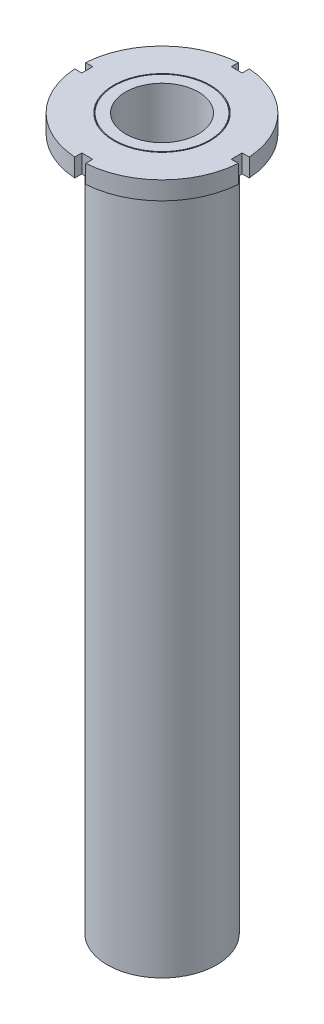
ISO-10303-21;
HEADER;
FILE_DESCRIPTION(('STEP AP214'),'2;1');
FILE_NAME('part.step','',(''),(''),'','','');
FILE_SCHEMA(('AUTOMOTIVE_DESIGN { 1 0 10303 214 1 1 1 1 }'));
ENDSEC;
DATA;
#1=APPLICATION_CONTEXT('core data for automotive mechanical design processes');
#2=APPLICATION_PROTOCOL_DEFINITION('international standard','automotive_design',2000,#1);
#3=PRODUCT_CONTEXT('',#1,'mechanical');
#4=PRODUCT('Part','Part','',(#3));
#5=PRODUCT_RELATED_PRODUCT_CATEGORY('part','',(#4));
#6=PRODUCT_DEFINITION_FORMATION('','',#4);
#7=PRODUCT_DEFINITION_CONTEXT('part definition',#1,'design');
#8=PRODUCT_DEFINITION('design','',#6,#7);
#9=PRODUCT_DEFINITION_SHAPE('','',#8);
#10=(LENGTH_UNIT() NAMED_UNIT(*) SI_UNIT(.MILLI.,.METRE.));
#11=(NAMED_UNIT(*) PLANE_ANGLE_UNIT() SI_UNIT($,.RADIAN.));
#12=(NAMED_UNIT(*) SI_UNIT($,.STERADIAN.) SOLID_ANGLE_UNIT());
#13=UNCERTAINTY_MEASURE_WITH_UNIT(LENGTH_MEASURE(1.E-05),#10,'distance_accuracy_value','');
#14=(GEOMETRIC_REPRESENTATION_CONTEXT(3) GLOBAL_UNCERTAINTY_ASSIGNED_CONTEXT((#13)) GLOBAL_UNIT_ASSIGNED_CONTEXT((#10,
#11,#12)) REPRESENTATION_CONTEXT('',''));
#15=CARTESIAN_POINT('',(0.,0.,0.));
#16=DIRECTION('',(0.,0.,1.));
#17=DIRECTION('',(1.,0.,0.));
#18=AXIS2_PLACEMENT_3D('',#15,#16,#17);
#19=CARTESIAN_POINT('',(0.,0.,0.));
#20=DIRECTION('',(0.,1.,0.));
#21=DIRECTION('',(0.,0.,1.));
#22=AXIS2_PLACEMENT_3D('',#19,#20,#21);
#23=CYLINDRICAL_SURFACE('',#22,10.);
#24=CARTESIAN_POINT('',(0.,0.,0.));
#25=DIRECTION('',(0.,1.,0.));
#26=DIRECTION('',(0.,0.,1.));
#27=AXIS2_PLACEMENT_3D('',#24,#25,#26);
#28=CIRCLE('',#27,10.);
#29=CARTESIAN_POINT('',(0.,0.,10.));
#30=VERTEX_POINT('',#29);
#31=EDGE_CURVE('E292',#30,#30,#28,.T.);
#32=ORIENTED_EDGE('',*,*,#31,.F.);
#33=EDGE_LOOP('',(#32));
#34=FACE_BOUND('',#33,.T.);
#35=CARTESIAN_POINT('',(0.,195.,0.));
#36=DIRECTION('',(0.,1.,0.));
#37=DIRECTION('',(0.,0.,1.));
#38=AXIS2_PLACEMENT_3D('',#35,#36,#37);
#39=CIRCLE('',#38,10.);
#40=CARTESIAN_POINT('',(0.,195.,10.));
#41=VERTEX_POINT('',#40);
#42=EDGE_CURVE('E296',#41,#41,#39,.T.);
#43=ORIENTED_EDGE('',*,*,#42,.T.);
#44=EDGE_LOOP('',(#43));
#45=FACE_BOUND('',#44,.T.);
#46=CARTESIAN_POINT('',(-9.88685996664259,180.,1.5));
#47=CARTESIAN_POINT('',(-9.88686136668593,179.91625443071,1.49999654107284));
#48=CARTESIAN_POINT('',(-9.88793551739101,179.832460249249,1.49296296388491));
#49=CARTESIAN_POINT('',(-9.8921131480324,179.667214685117,1.46502196657001));
#50=CARTESIAN_POINT('',(-9.8952186073143,179.58576566852,1.44410101402628));
#51=CARTESIAN_POINT('',(-9.90309938986228,179.427626244553,1.38902526098083));
#52=CARTESIAN_POINT('',(-9.90787343131536,179.350932237458,1.35488061681396));
#53=CARTESIAN_POINT('',(-9.91855194113145,179.204372969228,1.2743506308779));
#54=CARTESIAN_POINT('',(-9.92445625383668,179.134506769786,1.22796697429871));
#55=CARTESIAN_POINT('',(-9.9367828924804,179.003016183246,1.12387902418558));
#56=CARTESIAN_POINT('',(-9.94320862458058,178.941454386593,1.06609605584821));
#57=CARTESIAN_POINT('',(-9.95582368169047,178.828862514344,0.941019605444387));
#58=CARTESIAN_POINT('',(-9.96201299368614,178.777833017833,0.873725600786538));
#59=CARTESIAN_POINT('',(-9.97349347428185,178.687523368309,0.731136358052754));
#60=CARTESIAN_POINT('',(-9.97878018435569,178.648300849678,0.655804227365782));
#61=CARTESIAN_POINT('',(-9.98782206746405,178.583088401192,0.499528850106982));
#62=CARTESIAN_POINT('',(-9.99157732141945,178.557097772157,0.418585900270671));
#63=CARTESIAN_POINT('',(-9.99710914797782,178.519276611469,0.254031123090553));
#64=CARTESIAN_POINT('',(-9.99890035887344,178.507341273613,0.170443884389853));
#65=CARTESIAN_POINT('',(-10.0003524476958,178.497644065175,0.00243520401946687));
#66=CARTESIAN_POINT('',(-10.0000134440494,178.49988140668,-0.0819861910157597));
#67=CARTESIAN_POINT('',(-9.99725499660796,178.518383337762,-0.248551718200534));
#68=CARTESIAN_POINT('',(-9.99485227652479,178.534535171791,-0.330708691400022));
#69=CARTESIAN_POINT('',(-9.98825500227851,178.580230606323,-0.491132829143152));
#70=CARTESIAN_POINT('',(-9.98406040199739,178.609774551501,-0.569399893513498));
#71=CARTESIAN_POINT('',(-9.97432193873206,178.681530996917,-0.720163780770331));
#72=CARTESIAN_POINT('',(-9.96877303515638,178.723790965109,-0.792637672323608));
#73=CARTESIAN_POINT('',(-9.95694438245421,178.81974519367,-0.929507907150187));
#74=CARTESIAN_POINT('',(-9.95066458523184,178.873440206707,-0.993903718271746));
#75=CARTESIAN_POINT('',(-9.93800158192626,178.991368448827,-1.11345448272266));
#76=CARTESIAN_POINT('',(-9.93161796623256,179.05570012197,-1.16851232950947));
#77=CARTESIAN_POINT('',(-9.91952704453523,179.192741077124,-1.26706599338813));
#78=CARTESIAN_POINT('',(-9.91381974269649,179.26545041072,-1.31056173928));
#79=CARTESIAN_POINT('',(-9.90372775286855,179.417283962941,-1.38476964534605));
#80=CARTESIAN_POINT('',(-9.89934409845291,179.496413133662,-1.41547182270082));
#81=CARTESIAN_POINT('',(-9.89241402899059,179.658785255147,-1.46312336208879));
#82=CARTESIAN_POINT('',(-9.88986748446299,179.742027915547,-1.48007369337326));
#83=CARTESIAN_POINT('',(-9.88692451395027,179.909400089577,-1.49960720086656));
#84=CARTESIAN_POINT('',(-9.88650748802574,179.993513188202,-1.50232803265052));
#85=CARTESIAN_POINT('',(-9.88781607937153,180.160994194817,-1.49369057019819));
#86=CARTESIAN_POINT('',(-9.88954163015778,180.244362125851,-1.48233271282302));
#87=CARTESIAN_POINT('',(-9.89492202461453,180.407559817966,-1.44597702952766));
#88=CARTESIAN_POINT('',(-9.89856716482858,180.487405204942,-1.42104778527821));
#89=CARTESIAN_POINT('',(-9.90736801825768,180.641784092049,-1.35832831947087));
#90=CARTESIAN_POINT('',(-9.91252380607176,180.716317329628,-1.32053746276389));
#91=CARTESIAN_POINT('',(-9.92381355687063,180.858573260335,-1.23283677995324));
#92=CARTESIAN_POINT('',(-9.92995459279988,180.92624044728,-1.18283784561766));
#93=CARTESIAN_POINT('',(-9.94250159433355,181.052272859874,-1.07226416837202));
#94=CARTESIAN_POINT('',(-9.94890757490292,181.110637559181,-1.0116888274468));
#95=CARTESIAN_POINT('',(-9.96132705217386,181.216902606634,-0.881075619628179));
#96=CARTESIAN_POINT('',(-9.96733683460423,181.264711728242,-0.810963126771943));
#97=CARTESIAN_POINT('',(-9.97822905032016,181.347872905263,-0.663622080263657));
#98=CARTESIAN_POINT('',(-9.98311151444563,181.383225301465,-0.586393721360416));
#99=CARTESIAN_POINT('',(-9.99118269660795,181.440323742488,-0.427297995861125));
#100=CARTESIAN_POINT('',(-9.99437761717899,181.462119667078,-0.34544885875428));
#101=CARTESIAN_POINT('',(-9.99873976656896,181.491647879537,-0.179200815501173));
#102=CARTESIAN_POINT('',(-9.99990712930801,181.499381096249,-0.0948020781305642));
#103=CARTESIAN_POINT('',(-10.0000812905914,181.500541704549,0.0732645908608318));
#104=CARTESIAN_POINT('',(-9.99910917023796,181.494108680877,0.156931570212065));
#105=CARTESIAN_POINT('',(-9.99515610519141,181.467418611579,0.321979795323121));
#106=CARTESIAN_POINT('',(-9.99217516692666,181.447161610191,0.403361048396528));
#107=CARTESIAN_POINT('',(-9.98453786742463,181.39344812443,0.561489374379677));
#108=CARTESIAN_POINT('',(-9.97988273316946,181.360001304861,0.638239793148799));
#109=CARTESIAN_POINT('',(-9.96940834495499,181.280872512017,0.785061117896618));
#110=CARTESIAN_POINT('',(-9.96358905320338,181.23519014152,0.855131806920724));
#111=CARTESIAN_POINT('',(-9.95136510636178,181.132382301171,0.987312585191968));
#112=CARTESIAN_POINT('',(-9.94495548425942,181.075153774184,1.04934206644639));
#113=CARTESIAN_POINT('',(-9.93231001689001,180.95109492692,1.16296808390268));
#114=CARTESIAN_POINT('',(-9.92607421276291,180.884262356176,1.21456216798985));
#115=CARTESIAN_POINT('',(-9.91444484029116,180.742451016767,1.30611310822975));
#116=CARTESIAN_POINT('',(-9.90905620156986,180.667428582978,1.34600294291209));
#117=CARTESIAN_POINT('',(-9.89978909110724,180.511703223237,1.41255613872045));
#118=CARTESIAN_POINT('',(-9.89590905307931,180.431006292142,1.43923322574898));
#119=CARTESIAN_POINT('',(-9.89099485524825,180.291622563744,1.47254951890027));
#120=CARTESIAN_POINT('',(-9.88945249382379,180.233796603076,1.4828276978042));
#121=CARTESIAN_POINT('',(-9.88738456567011,180.117321708266,1.49655410576574));
#122=CARTESIAN_POINT('',(-9.88685898576155,180.0586727848,1.50000242335076));
#123=CARTESIAN_POINT('',(-9.88685996664259,180.,1.5));
#124=B_SPLINE_CURVE_WITH_KNOTS('',3,(#46,#47,#48,#49,#50,#51,#52,#53,#54,#55,#56,#57,#58,#59,
#60,#61,#62,#63,#64,#65,#66,#67,#68,#69,#70,#71,#72,#73,#74,#75,#76,#77,#78,#79,#80,#81,#82,#83,
#84,#85,#86,#87,#88,#89,#90,#91,#92,#93,#94,#95,#96,#97,#98,#99,#100,#101,#102,#103,#104,#105,
#106,#107,#108,#109,#110,#111,#112,#113,#114,#115,#116,#117,#118,#119,#120,#121,#122,#123),
.UNSPECIFIED.,.T.,.F.,(4,2,2,2,2,2,2,2,2,2,2,2,2,2,2,2,2,2,2,2,2,2,2,2,2,2,2,2,2,2,2,2,2,2,2,2,
2,2,4),(0.,0.251022251804883,0.502289469561815,0.753364085335707,1.00440414866133,
1.25724158649107,1.51009292207815,1.76415922105781,2.01821209364502,2.27035832534398,
2.52249053939376,2.7725986251573,3.02271314839403,3.27377316386455,3.52484970949275,
3.77839544666272,4.03194274514351,4.28568751773139,4.53941440444342,4.79068214603744,
5.0419420909992,5.29194394807375,5.54195815286117,5.79385486001301,6.04576581461802,
6.29977537753518,6.55377799071857,6.80684040891092,7.05988611170474,7.31044963622328,
7.56101235892824,7.81139182257835,8.06177941567107,8.31450950010968,8.56729890236864,
8.82150878824931,9.07545403445563,9.25132441891613,9.42719252376192),.UNSPECIFIED.);
#125=CARTESIAN_POINT('',(-9.88685996664259,180.,1.5));
#126=VERTEX_POINT('',#125);
#127=EDGE_CURVE('E51',#126,#126,#124,.T.);
#128=ORIENTED_EDGE('',*,*,#127,.F.);
#129=EDGE_LOOP('',(#128));
#130=FACE_BOUND('',#129,.T.);
#131=CARTESIAN_POINT('',(9.88685996664259,180.,1.5));
#132=CARTESIAN_POINT('',(9.88686136668593,180.08374556929,1.49999654107284));
#133=CARTESIAN_POINT('',(9.88793551739101,180.167539750751,1.49296296388491));
#134=CARTESIAN_POINT('',(9.8921131480324,180.332785314883,1.46502196657001));
#135=CARTESIAN_POINT('',(9.8952186073143,180.41423433148,1.44410101402628));
#136=CARTESIAN_POINT('',(9.90309938986228,180.572373755447,1.38902526098083));
#137=CARTESIAN_POINT('',(9.90787343131536,180.649067762542,1.35488061681396));
#138=CARTESIAN_POINT('',(9.91855194113145,180.795627030772,1.2743506308779));
#139=CARTESIAN_POINT('',(9.92445625383668,180.865493230214,1.22796697429871));
#140=CARTESIAN_POINT('',(9.9367828924804,180.996983816754,1.12387902418558));
#141=CARTESIAN_POINT('',(9.94320862458058,181.058545613407,1.0660960558482));
#142=CARTESIAN_POINT('',(9.95582368169047,181.171137485655,0.941019605444375));
#143=CARTESIAN_POINT('',(9.96201299368615,181.222166982167,0.873725600786533));
#144=CARTESIAN_POINT('',(9.97349347428185,181.312476631691,0.731136358052753));
#145=CARTESIAN_POINT('',(9.97878018435569,181.351699150322,0.655804227365775));
#146=CARTESIAN_POINT('',(9.98782206746405,181.416911598808,0.499528850106974));
#147=CARTESIAN_POINT('',(9.99157732141945,181.442902227843,0.418585900270668));
#148=CARTESIAN_POINT('',(9.99710914797782,181.480723388531,0.254031123090553));
#149=CARTESIAN_POINT('',(9.99890035887344,181.492658726387,0.170443884389853));
#150=CARTESIAN_POINT('',(10.0003524476958,181.502355934825,0.00243520401946675));
#151=CARTESIAN_POINT('',(10.0000134440494,181.50011859332,-0.0819861910157597));
#152=CARTESIAN_POINT('',(9.99725499660796,181.481616662238,-0.248551718200534));
#153=CARTESIAN_POINT('',(9.99485227652479,181.465464828209,-0.330708691400022));
#154=CARTESIAN_POINT('',(9.98825500227851,181.419769393677,-0.491132829143152));
#155=CARTESIAN_POINT('',(9.98406040199739,181.390225448499,-0.569399893513498));
#156=CARTESIAN_POINT('',(9.97432193873206,181.318469003083,-0.720163780770331));
#157=CARTESIAN_POINT('',(9.96877303515638,181.276209034891,-0.792637672323608));
#158=CARTESIAN_POINT('',(9.95694438245421,181.18025480633,-0.929507907150187));
#159=CARTESIAN_POINT('',(9.95066458523184,181.126559793293,-0.993903718271746));
#160=CARTESIAN_POINT('',(9.93800158192626,181.008631551173,-1.11345448272266));
#161=CARTESIAN_POINT('',(9.93161796623256,180.94429987803,-1.16851232950947));
#162=CARTESIAN_POINT('',(9.91952704453523,180.807258922876,-1.26706599338813));
#163=CARTESIAN_POINT('',(9.91381974269649,180.73454958928,-1.31056173928));
#164=CARTESIAN_POINT('',(9.90372775286855,180.582716037059,-1.38476964534605));
#165=CARTESIAN_POINT('',(9.89934409845291,180.503586866338,-1.41547182270082));
#166=CARTESIAN_POINT('',(9.89241402899059,180.341214744853,-1.46312336208879));
#167=CARTESIAN_POINT('',(9.88986748446299,180.257972084453,-1.48007369337326));
#168=CARTESIAN_POINT('',(9.88692451395027,180.090599910422,-1.49960720086656));
#169=CARTESIAN_POINT('',(9.88650748802574,180.006486811798,-1.50232803265052));
#170=CARTESIAN_POINT('',(9.88781607937153,179.839005805183,-1.49369057019819));
#171=CARTESIAN_POINT('',(9.88954163015778,179.755637874149,-1.48233271282302));
#172=CARTESIAN_POINT('',(9.89492202461453,179.592440182034,-1.44597702952766));
#173=CARTESIAN_POINT('',(9.89856716482858,179.512594795058,-1.4210477852782));
#174=CARTESIAN_POINT('',(9.90736801825768,179.358215907951,-1.35832831947086));
#175=CARTESIAN_POINT('',(9.91252380607176,179.283682670372,-1.32053746276389));
#176=CARTESIAN_POINT('',(9.92381355687063,179.141426739665,-1.23283677995324));
#177=CARTESIAN_POINT('',(9.92995459279988,179.07375955272,-1.18283784561766));
#178=CARTESIAN_POINT('',(9.94250159433355,178.947727140126,-1.07226416837202));
#179=CARTESIAN_POINT('',(9.94890757490292,178.889362440819,-1.0116888274468));
#180=CARTESIAN_POINT('',(9.96132705217386,178.783097393366,-0.881075619628186));
#181=CARTESIAN_POINT('',(9.96733683460423,178.735288271758,-0.81096312677196));
#182=CARTESIAN_POINT('',(9.97822905032015,178.652127094737,-0.663622080263675));
#183=CARTESIAN_POINT('',(9.98311151444563,178.616774698535,-0.586393721360424));
#184=CARTESIAN_POINT('',(9.99118269660795,178.559676257512,-0.427297995861123));
#185=CARTESIAN_POINT('',(9.99437761717899,178.537880332922,-0.345448858754279));
#186=CARTESIAN_POINT('',(9.99873976656896,178.508352120463,-0.179200815501174));
#187=CARTESIAN_POINT('',(9.99990712930801,178.500618903751,-0.0948020781305643));
#188=CARTESIAN_POINT('',(10.0000812905914,178.499458295451,0.0732645908608319));
#189=CARTESIAN_POINT('',(9.99910917023796,178.505891319123,0.156931570212065));
#190=CARTESIAN_POINT('',(9.99515610519141,178.532581388421,0.321979795323121));
#191=CARTESIAN_POINT('',(9.99217516692666,178.552838389809,0.403361048396527));
#192=CARTESIAN_POINT('',(9.98453786742463,178.60655187557,0.561489374379677));
#193=CARTESIAN_POINT('',(9.97988273316946,178.639998695139,0.638239793148799));
#194=CARTESIAN_POINT('',(9.96940834495499,178.719127487983,0.785061117896618));
#195=CARTESIAN_POINT('',(9.96358905320338,178.76480985848,0.855131806920724));
#196=CARTESIAN_POINT('',(9.95136510636178,178.867617698829,0.987312585191968));
#197=CARTESIAN_POINT('',(9.94495548425942,178.924846225816,1.04934206644639));
#198=CARTESIAN_POINT('',(9.93231001689001,179.04890507308,1.16296808390268));
#199=CARTESIAN_POINT('',(9.92607421276291,179.115737643824,1.21456216798984));
#200=CARTESIAN_POINT('',(9.91444484029116,179.257548983233,1.30611310822976));
#201=CARTESIAN_POINT('',(9.90905620156985,179.332571417022,1.34600294291211));
#202=CARTESIAN_POINT('',(9.89978909110724,179.488296776763,1.41255613872046));
#203=CARTESIAN_POINT('',(9.89590905307931,179.568993707858,1.43923322574898));
#204=CARTESIAN_POINT('',(9.89099485524825,179.708377436256,1.47254951890026));
#205=CARTESIAN_POINT('',(9.88945249382379,179.766203396924,1.4828276978042));
#206=CARTESIAN_POINT('',(9.88738456567011,179.882678291734,1.49655410576574));
#207=CARTESIAN_POINT('',(9.88685898576155,179.9413272152,1.50000242335076));
#208=CARTESIAN_POINT('',(9.88685996664259,180.,1.5));
#209=B_SPLINE_CURVE_WITH_KNOTS('',3,(#131,#132,#133,#134,#135,#136,#137,#138,#139,#140,#141,
#142,#143,#144,#145,#146,#147,#148,#149,#150,#151,#152,#153,#154,#155,#156,#157,#158,#159,#160,
#161,#162,#163,#164,#165,#166,#167,#168,#169,#170,#171,#172,#173,#174,#175,#176,#177,#178,#179,
#180,#181,#182,#183,#184,#185,#186,#187,#188,#189,#190,#191,#192,#193,#194,#195,#196,#197,#198,
#199,#200,#201,#202,#203,#204,#205,#206,#207,#208),.UNSPECIFIED.,.T.,.F.,(4,2,2,2,2,2,2,2,2,2,2,
2,2,2,2,2,2,2,2,2,2,2,2,2,2,2,2,2,2,2,2,2,2,2,2,2,2,2,4),(0.,0.251022251804883,
0.502289469561815,0.753364085335707,1.00440414866133,1.25724158649108,1.51009292207815,
1.76415922105782,2.01821209364502,2.27035832534398,2.52249053939375,2.77259862515729,
3.02271314839403,3.27377316386455,3.52484970949275,3.77839544666271,4.03194274514351,
4.28568751773139,4.53941440444341,4.79068214603744,5.0419420909992,5.29194394807378,
5.54195815286117,5.79385486001301,6.04576581461802,6.29977537753516,6.55377799071857,
6.80684040891092,7.05988611170474,7.31044963622328,7.56101235892824,7.81139182257835,
8.06177941567107,8.31450950010968,8.56729890236864,8.82150878824934,9.07545403445563,
9.25132441891613,9.42719252376192),.UNSPECIFIED.);
#210=CARTESIAN_POINT('',(9.88685996664259,180.,1.5));
#211=VERTEX_POINT('',#210);
#212=EDGE_CURVE('E11',#211,#211,#209,.T.);
#213=ORIENTED_EDGE('',*,*,#212,.F.);
#214=EDGE_LOOP('',(#213));
#215=FACE_BOUND('',#214,.T.);
#216=ADVANCED_FACE('F37',(#34,#45,#130,#215),#23,.F.);
#217=CARTESIAN_POINT('',(0.,190.,0.));
#218=DIRECTION('',(0.,-1.,0.));
#219=DIRECTION('',(0.,0.,-1.));
#220=AXIS2_PLACEMENT_3D('',#217,#218,#219);
#221=CYLINDRICAL_SURFACE('',#220,15.);
#222=CARTESIAN_POINT('',(0.,190.,0.));
#223=DIRECTION('',(0.,1.,0.));
#224=DIRECTION('',(0.,0.,1.));
#225=AXIS2_PLACEMENT_3D('',#222,#223,#224);
#226=CIRCLE('',#225,15.);
#227=CARTESIAN_POINT('',(0.,190.,15.));
#228=VERTEX_POINT('',#227);
#229=EDGE_CURVE('E259',#228,#228,#226,.T.);
#230=ORIENTED_EDGE('',*,*,#229,.F.);
#231=EDGE_LOOP('',(#230));
#232=FACE_BOUND('',#231,.T.);
#233=CARTESIAN_POINT('',(0.,0.,0.));
#234=DIRECTION('',(0.,1.,0.));
#235=DIRECTION('',(0.,0.,1.));
#236=AXIS2_PLACEMENT_3D('',#233,#234,#235);
#237=CIRCLE('',#236,15.);
#238=CARTESIAN_POINT('',(0.,0.,15.));
#239=VERTEX_POINT('',#238);
#240=EDGE_CURVE('E258',#239,#239,#237,.T.);
#241=ORIENTED_EDGE('',*,*,#240,.T.);
#242=EDGE_LOOP('',(#241));
#243=FACE_BOUND('',#242,.T.);
#244=ADVANCED_FACE('F39',(#232,#243),#221,.T.);
#245=CARTESIAN_POINT('',(0.,0.,0.));
#246=DIRECTION('',(0.,1.,0.));
#247=DIRECTION('',(0.,0.,1.));
#248=AXIS2_PLACEMENT_3D('',#245,#246,#247);
#249=PLANE('',#248);
#250=ORIENTED_EDGE('',*,*,#31,.T.);
#251=EDGE_LOOP('',(#250));
#252=FACE_BOUND('',#251,.T.);
#253=ORIENTED_EDGE('',*,*,#240,.F.);
#254=EDGE_LOOP('',(#253));
#255=FACE_BOUND('',#254,.T.);
#256=ADVANCED_FACE('F287',(#252,#255),#249,.F.);
#257=CARTESIAN_POINT('',(1.50000000000205,195.,-20.5000000000004));
#258=DIRECTION('',(1.,0.,0.));
#259=DIRECTION('',(0.,0.,-1.));
#260=AXIS2_PLACEMENT_3D('',#257,#258,#259);
#261=PLANE('',#260);
#262=DIRECTION('',(0.,0.,1.));
#263=VECTOR('',#262,1.);
#264=CARTESIAN_POINT('',(1.50000000000205,190.,-20.5000000000004));
#265=LINE('',#264,#263);
#266=CARTESIAN_POINT('',(1.50000000000206,190.,-22.4499443206442));
#267=VERTEX_POINT('',#266);
#268=CARTESIAN_POINT('',(1.50000000000205,190.,-20.5000000000004));
#269=VERTEX_POINT('',#268);
#270=EDGE_CURVE('E188',#267,#269,#265,.T.);
#271=ORIENTED_EDGE('',*,*,#270,.T.);
#272=DIRECTION('',(0.,-1.,0.));
#273=VECTOR('',#272,1.);
#274=CARTESIAN_POINT('',(1.50000000000205,195.,-20.5000000000004));
#275=LINE('',#274,#273);
#276=CARTESIAN_POINT('',(1.50000000000205,195.,-20.5000000000004));
#277=VERTEX_POINT('',#276);
#278=EDGE_CURVE('E256',#277,#269,#275,.T.);
#279=ORIENTED_EDGE('',*,*,#278,.F.);
#280=DIRECTION('',(0.,0.,1.));
#281=VECTOR('',#280,1.);
#282=CARTESIAN_POINT('',(1.50000000000205,195.,-20.5000000000004));
#283=LINE('',#282,#281);
#284=CARTESIAN_POINT('',(1.50000000000206,195.,-22.4499443206442));
#285=VERTEX_POINT('',#284);
#286=EDGE_CURVE('E219',#285,#277,#283,.T.);
#287=ORIENTED_EDGE('',*,*,#286,.F.);
#288=DIRECTION('',(0.,-1.,0.));
#289=VECTOR('',#288,1.);
#290=CARTESIAN_POINT('',(1.50000000000206,195.,-22.4499443206442));
#291=LINE('',#290,#289);
#292=EDGE_CURVE('E184',#285,#267,#291,.T.);
#293=ORIENTED_EDGE('',*,*,#292,.T.);
#294=EDGE_LOOP('',(#271,#279,#287,#293));
#295=FACE_BOUND('',#294,.T.);
#296=ADVANCED_FACE('F351',(#295),#261,.F.);
#297=CARTESIAN_POINT('',(-1.49999999999797,195.,-20.5000000000004));
#298=DIRECTION('',(0.,0.,1.));
#299=DIRECTION('',(1.,0.,0.));
#300=AXIS2_PLACEMENT_3D('',#297,#298,#299);
#301=PLANE('',#300);
#302=DIRECTION('',(-1.,0.,0.));
#303=VECTOR('',#302,1.);
#304=CARTESIAN_POINT('',(-1.49999999999797,190.,-20.5000000000004));
#305=LINE('',#304,#303);
#306=CARTESIAN_POINT('',(-1.49999999999797,190.,-20.5000000000004));
#307=VERTEX_POINT('',#306);
#308=EDGE_CURVE('E191',#269,#307,#305,.T.);
#309=ORIENTED_EDGE('',*,*,#308,.T.);
#310=DIRECTION('',(0.,-1.,0.));
#311=VECTOR('',#310,1.);
#312=CARTESIAN_POINT('',(-1.49999999999797,195.,-20.5000000000004));
#313=LINE('',#312,#311);
#314=CARTESIAN_POINT('',(-1.49999999999797,195.,-20.5000000000004));
#315=VERTEX_POINT('',#314);
#316=EDGE_CURVE('E253',#315,#307,#313,.T.);
#317=ORIENTED_EDGE('',*,*,#316,.F.);
#318=DIRECTION('',(-1.,0.,0.));
#319=VECTOR('',#318,1.);
#320=CARTESIAN_POINT('',(-1.49999999999797,195.,-20.5000000000004));
#321=LINE('',#320,#319);
#322=EDGE_CURVE('E127',#277,#315,#321,.T.);
#323=ORIENTED_EDGE('',*,*,#322,.F.);
#324=ORIENTED_EDGE('',*,*,#278,.T.);
#325=EDGE_LOOP('',(#309,#317,#323,#324));
#326=FACE_BOUND('',#325,.T.);
#327=ADVANCED_FACE('F405',(#326),#301,.F.);
#328=CARTESIAN_POINT('',(-1.49999999999797,195.,-20.5000000000004));
#329=DIRECTION('',(-1.,0.,0.));
#330=DIRECTION('',(0.,0.,1.));
#331=AXIS2_PLACEMENT_3D('',#328,#329,#330);
#332=PLANE('',#331);
#333=DIRECTION('',(0.,0.,-1.));
#334=VECTOR('',#333,1.);
#335=CARTESIAN_POINT('',(-1.49999999999797,190.,-20.5000000000004));
#336=LINE('',#335,#334);
#337=CARTESIAN_POINT('',(-1.49999999999797,190.,-22.4499443206441));
#338=VERTEX_POINT('',#337);
#339=EDGE_CURVE('E194',#307,#338,#336,.T.);
#340=ORIENTED_EDGE('',*,*,#339,.T.);
#341=DIRECTION('',(0.,-1.,0.));
#342=VECTOR('',#341,1.);
#343=CARTESIAN_POINT('',(-1.49999999999797,195.,-22.4499443206441));
#344=LINE('',#343,#342);
#345=CARTESIAN_POINT('',(-1.49999999999797,195.,-22.4499443206441));
#346=VERTEX_POINT('',#345);
#347=EDGE_CURVE('E250',#346,#338,#344,.T.);
#348=ORIENTED_EDGE('',*,*,#347,.F.);
#349=DIRECTION('',(0.,0.,-1.));
#350=VECTOR('',#349,1.);
#351=CARTESIAN_POINT('',(-1.49999999999797,195.,-20.5000000000004));
#352=LINE('',#351,#350);
#353=EDGE_CURVE('E316',#315,#346,#352,.T.);
#354=ORIENTED_EDGE('',*,*,#353,.F.);
#355=ORIENTED_EDGE('',*,*,#316,.T.);
#356=EDGE_LOOP('',(#340,#348,#354,#355));
#357=FACE_BOUND('',#356,.T.);
#358=ADVANCED_FACE('F401',(#357),#332,.F.);
#359=CARTESIAN_POINT('',(2.03656536079677E-12,195.,-1.35958952429682E-13));
#360=DIRECTION('',(0.,-1.,0.));
#361=DIRECTION('',(0.,0.,-1.));
#362=AXIS2_PLACEMENT_3D('',#359,#360,#361);
#363=CYLINDRICAL_SURFACE('',#362,22.5000000000001);
#364=CARTESIAN_POINT('',(2.03656536079677E-12,190.,-1.35958952429682E-13));
#365=DIRECTION('',(0.,1.,0.));
#366=DIRECTION('',(0.,0.,1.));
#367=AXIS2_PLACEMENT_3D('',#364,#365,#366);
#368=CIRCLE('',#367,22.5000000000001);
#369=CARTESIAN_POINT('',(-22.4499443206419,190.,-1.49999999999755));
#370=VERTEX_POINT('',#369);
#371=EDGE_CURVE('E196',#338,#370,#368,.T.);
#372=ORIENTED_EDGE('',*,*,#371,.T.);
#373=DIRECTION('',(0.,-1.,0.));
#374=VECTOR('',#373,1.);
#375=CARTESIAN_POINT('',(-22.4499443206419,195.,-1.49999999999755));
#376=LINE('',#375,#374);
#377=CARTESIAN_POINT('',(-22.4499443206419,195.,-1.49999999999755));
#378=VERTEX_POINT('',#377);
#379=EDGE_CURVE('E247',#378,#370,#376,.T.);
#380=ORIENTED_EDGE('',*,*,#379,.F.);
#381=CARTESIAN_POINT('',(2.03656536079677E-12,195.,-1.35958952429682E-13));
#382=DIRECTION('',(0.,1.,0.));
#383=DIRECTION('',(0.,0.,1.));
#384=AXIS2_PLACEMENT_3D('',#381,#382,#383);
#385=CIRCLE('',#384,22.5000000000001);
#386=EDGE_CURVE('E318',#346,#378,#385,.T.);
#387=ORIENTED_EDGE('',*,*,#386,.F.);
#388=ORIENTED_EDGE('',*,*,#347,.T.);
#389=EDGE_LOOP('',(#372,#380,#387,#388));
#390=FACE_BOUND('',#389,.T.);
#391=ADVANCED_FACE('F397',(#390),#363,.T.);
#392=CARTESIAN_POINT('',(-20.4999999999981,195.,-1.49999999999753));
#393=DIRECTION('',(0.,0.,-1.));
#394=DIRECTION('',(-1.,0.,0.));
#395=AXIS2_PLACEMENT_3D('',#392,#393,#394);
#396=PLANE('',#395);
#397=DIRECTION('',(1.,0.,0.));
#398=VECTOR('',#397,1.);
#399=CARTESIAN_POINT('',(-20.4999999999981,190.,-1.49999999999753));
#400=LINE('',#399,#398);
#401=CARTESIAN_POINT('',(-20.4999999999981,190.,-1.49999999999753));
#402=VERTEX_POINT('',#401);
#403=EDGE_CURVE('E198',#370,#402,#400,.T.);
#404=ORIENTED_EDGE('',*,*,#403,.T.);
#405=DIRECTION('',(0.,-1.,0.));
#406=VECTOR('',#405,1.);
#407=CARTESIAN_POINT('',(-20.4999999999981,195.,-1.49999999999753));
#408=LINE('',#407,#406);
#409=CARTESIAN_POINT('',(-20.4999999999981,195.,-1.49999999999753));
#410=VERTEX_POINT('',#409);
#411=EDGE_CURVE('E244',#410,#402,#408,.T.);
#412=ORIENTED_EDGE('',*,*,#411,.F.);
#413=DIRECTION('',(1.,0.,0.));
#414=VECTOR('',#413,1.);
#415=CARTESIAN_POINT('',(-20.4999999999981,195.,-1.49999999999753));
#416=LINE('',#415,#414);
#417=EDGE_CURVE('E320',#378,#410,#416,.T.);
#418=ORIENTED_EDGE('',*,*,#417,.F.);
#419=ORIENTED_EDGE('',*,*,#379,.T.);
#420=EDGE_LOOP('',(#404,#412,#418,#419));
#421=FACE_BOUND('',#420,.T.);
#422=ADVANCED_FACE('F393',(#421),#396,.F.);
#423=CARTESIAN_POINT('',(-20.4999999999981,195.,1.50000000000246));
#424=DIRECTION('',(1.,0.,0.));
#425=DIRECTION('',(0.,0.,-1.));
#426=AXIS2_PLACEMENT_3D('',#423,#424,#425);
#427=PLANE('',#426);
#428=DIRECTION('',(0.,0.,1.));
#429=VECTOR('',#428,1.);
#430=CARTESIAN_POINT('',(-20.4999999999981,190.,1.50000000000246));
#431=LINE('',#430,#429);
#432=CARTESIAN_POINT('',(-20.4999999999981,190.,1.50000000000246));
#433=VERTEX_POINT('',#432);
#434=EDGE_CURVE('E200',#402,#433,#431,.T.);
#435=ORIENTED_EDGE('',*,*,#434,.T.);
#436=DIRECTION('',(0.,-1.,0.));
#437=VECTOR('',#436,1.);
#438=CARTESIAN_POINT('',(-20.4999999999981,195.,1.50000000000246));
#439=LINE('',#438,#437);
#440=CARTESIAN_POINT('',(-20.4999999999981,195.,1.50000000000246));
#441=VERTEX_POINT('',#440);
#442=EDGE_CURVE('E241',#441,#433,#439,.T.);
#443=ORIENTED_EDGE('',*,*,#442,.F.);
#444=DIRECTION('',(0.,0.,1.));
#445=VECTOR('',#444,1.);
#446=CARTESIAN_POINT('',(-20.4999999999981,195.,1.50000000000246));
#447=LINE('',#446,#445);
#448=EDGE_CURVE('E322',#410,#441,#447,.T.);
#449=ORIENTED_EDGE('',*,*,#448,.F.);
#450=ORIENTED_EDGE('',*,*,#411,.T.);
#451=EDGE_LOOP('',(#435,#443,#449,#450));
#452=FACE_BOUND('',#451,.T.);
#453=ADVANCED_FACE('F389',(#452),#427,.F.);
#454=CARTESIAN_POINT('',(-20.4999999999981,195.,1.50000000000246));
#455=DIRECTION('',(0.,0.,1.));
#456=DIRECTION('',(1.,0.,0.));
#457=AXIS2_PLACEMENT_3D('',#454,#455,#456);
#458=PLANE('',#457);
#459=DIRECTION('',(-1.,0.,0.));
#460=VECTOR('',#459,1.);
#461=CARTESIAN_POINT('',(-20.4999999999981,190.,1.50000000000246));
#462=LINE('',#461,#460);
#463=CARTESIAN_POINT('',(-22.4499443206417,190.,1.50000000000246));
#464=VERTEX_POINT('',#463);
#465=EDGE_CURVE('E202',#433,#464,#462,.T.);
#466=ORIENTED_EDGE('',*,*,#465,.T.);
#467=DIRECTION('',(0.,-1.,0.));
#468=VECTOR('',#467,1.);
#469=CARTESIAN_POINT('',(-22.4499443206417,195.,1.50000000000246));
#470=LINE('',#469,#468);
#471=CARTESIAN_POINT('',(-22.4499443206417,195.,1.50000000000246));
#472=VERTEX_POINT('',#471);
#473=EDGE_CURVE('E238',#472,#464,#470,.T.);
#474=ORIENTED_EDGE('',*,*,#473,.F.);
#475=DIRECTION('',(-1.,0.,0.));
#476=VECTOR('',#475,1.);
#477=CARTESIAN_POINT('',(-20.4999999999981,195.,1.50000000000246));
#478=LINE('',#477,#476);
#479=EDGE_CURVE('E324',#441,#472,#478,.T.);
#480=ORIENTED_EDGE('',*,*,#479,.F.);
#481=ORIENTED_EDGE('',*,*,#442,.T.);
#482=EDGE_LOOP('',(#466,#474,#480,#481));
#483=FACE_BOUND('',#482,.T.);
#484=ADVANCED_FACE('F385',(#483),#458,.F.);
#485=CARTESIAN_POINT('',(2.03656536079677E-12,195.,-1.35958952429682E-13));
#486=DIRECTION('',(0.,-1.,0.));
#487=DIRECTION('',(0.,0.,-1.));
#488=AXIS2_PLACEMENT_3D('',#485,#486,#487);
#489=CYLINDRICAL_SURFACE('',#488,22.5000000000004);
#490=CARTESIAN_POINT('',(2.03656536079677E-12,190.,-1.35958952429682E-13));
#491=DIRECTION('',(0.,1.,0.));
#492=DIRECTION('',(0.,0.,1.));
#493=AXIS2_PLACEMENT_3D('',#490,#491,#492);
#494=CIRCLE('',#493,22.5000000000004);
#495=CARTESIAN_POINT('',(-1.4999999999956,190.,22.4499443206441));
#496=VERTEX_POINT('',#495);
#497=EDGE_CURVE('E204',#464,#496,#494,.T.);
#498=ORIENTED_EDGE('',*,*,#497,.T.);
#499=DIRECTION('',(0.,-1.,0.));
#500=VECTOR('',#499,1.);
#501=CARTESIAN_POINT('',(-1.4999999999956,195.,22.4499443206441));
#502=LINE('',#501,#500);
#503=CARTESIAN_POINT('',(-1.4999999999956,195.,22.4499443206441));
#504=VERTEX_POINT('',#503);
#505=EDGE_CURVE('E235',#504,#496,#502,.T.);
#506=ORIENTED_EDGE('',*,*,#505,.F.);
#507=CARTESIAN_POINT('',(2.03656536079677E-12,195.,-1.35958952429682E-13));
#508=DIRECTION('',(0.,1.,0.));
#509=DIRECTION('',(0.,0.,1.));
#510=AXIS2_PLACEMENT_3D('',#507,#508,#509);
#511=CIRCLE('',#510,22.5000000000004);
#512=EDGE_CURVE('E326',#472,#504,#511,.T.);
#513=ORIENTED_EDGE('',*,*,#512,.F.);
#514=ORIENTED_EDGE('',*,*,#473,.T.);
#515=EDGE_LOOP('',(#498,#506,#513,#514));
#516=FACE_BOUND('',#515,.T.);
#517=ADVANCED_FACE('F381',(#516),#489,.T.);
#518=CARTESIAN_POINT('',(-1.4999999999956,195.,20.5000000000005));
#519=DIRECTION('',(-1.,0.,0.));
#520=DIRECTION('',(0.,0.,1.));
#521=AXIS2_PLACEMENT_3D('',#518,#519,#520);
#522=PLANE('',#521);
#523=DIRECTION('',(0.,0.,-1.));
#524=VECTOR('',#523,1.);
#525=CARTESIAN_POINT('',(-1.4999999999956,190.,20.5000000000005));
#526=LINE('',#525,#524);
#527=CARTESIAN_POINT('',(-1.4999999999956,190.,20.5000000000005));
#528=VERTEX_POINT('',#527);
#529=EDGE_CURVE('E206',#496,#528,#526,.T.);
#530=ORIENTED_EDGE('',*,*,#529,.T.);
#531=DIRECTION('',(0.,-1.,0.));
#532=VECTOR('',#531,1.);
#533=CARTESIAN_POINT('',(-1.4999999999956,195.,20.5000000000005));
#534=LINE('',#533,#532);
#535=CARTESIAN_POINT('',(-1.4999999999956,195.,20.5000000000005));
#536=VERTEX_POINT('',#535);
#537=EDGE_CURVE('E232',#536,#528,#534,.T.);
#538=ORIENTED_EDGE('',*,*,#537,.F.);
#539=DIRECTION('',(0.,0.,-1.));
#540=VECTOR('',#539,1.);
#541=CARTESIAN_POINT('',(-1.4999999999956,195.,20.5000000000005));
#542=LINE('',#541,#540);
#543=EDGE_CURVE('E328',#504,#536,#542,.T.);
#544=ORIENTED_EDGE('',*,*,#543,.F.);
#545=ORIENTED_EDGE('',*,*,#505,.T.);
#546=EDGE_LOOP('',(#530,#538,#544,#545));
#547=FACE_BOUND('',#546,.T.);
#548=ADVANCED_FACE('F377',(#547),#522,.F.);
#549=CARTESIAN_POINT('',(1.5000000000044,195.,20.5000000000005));
#550=DIRECTION('',(0.,0.,-1.));
#551=DIRECTION('',(-1.,0.,0.));
#552=AXIS2_PLACEMENT_3D('',#549,#550,#551);
#553=PLANE('',#552);
#554=DIRECTION('',(1.,0.,0.));
#555=VECTOR('',#554,1.);
#556=CARTESIAN_POINT('',(1.5000000000044,190.,20.5000000000005));
#557=LINE('',#556,#555);
#558=CARTESIAN_POINT('',(1.5000000000044,190.,20.5000000000005));
#559=VERTEX_POINT('',#558);
#560=EDGE_CURVE('E208',#528,#559,#557,.T.);
#561=ORIENTED_EDGE('',*,*,#560,.T.);
#562=DIRECTION('',(0.,-1.,0.));
#563=VECTOR('',#562,1.);
#564=CARTESIAN_POINT('',(1.5000000000044,195.,20.5000000000005));
#565=LINE('',#564,#563);
#566=CARTESIAN_POINT('',(1.5000000000044,195.,20.5000000000005));
#567=VERTEX_POINT('',#566);
#568=EDGE_CURVE('E229',#567,#559,#565,.T.);
#569=ORIENTED_EDGE('',*,*,#568,.F.);
#570=DIRECTION('',(1.,0.,0.));
#571=VECTOR('',#570,1.);
#572=CARTESIAN_POINT('',(1.5000000000044,195.,20.5000000000005));
#573=LINE('',#572,#571);
#574=EDGE_CURVE('E330',#536,#567,#573,.T.);
#575=ORIENTED_EDGE('',*,*,#574,.F.);
#576=ORIENTED_EDGE('',*,*,#537,.T.);
#577=EDGE_LOOP('',(#561,#569,#575,#576));
#578=FACE_BOUND('',#577,.T.);
#579=ADVANCED_FACE('F373',(#578),#553,.F.);
#580=CARTESIAN_POINT('',(1.5000000000044,195.,20.5000000000005));
#581=DIRECTION('',(1.,0.,0.));
#582=DIRECTION('',(0.,0.,-1.));
#583=AXIS2_PLACEMENT_3D('',#580,#581,#582);
#584=PLANE('',#583);
#585=DIRECTION('',(0.,0.,1.));
#586=VECTOR('',#585,1.);
#587=CARTESIAN_POINT('',(1.5000000000044,190.,20.5000000000005));
#588=LINE('',#587,#586);
#589=CARTESIAN_POINT('',(1.50000000000439,190.,22.4499443206442));
#590=VERTEX_POINT('',#589);
#591=EDGE_CURVE('E210',#559,#590,#588,.T.);
#592=ORIENTED_EDGE('',*,*,#591,.T.);
#593=DIRECTION('',(0.,-1.,0.));
#594=VECTOR('',#593,1.);
#595=CARTESIAN_POINT('',(1.50000000000439,195.,22.4499443206442));
#596=LINE('',#595,#594);
#597=CARTESIAN_POINT('',(1.50000000000439,195.,22.4499443206442));
#598=VERTEX_POINT('',#597);
#599=EDGE_CURVE('E226',#598,#590,#596,.T.);
#600=ORIENTED_EDGE('',*,*,#599,.F.);
#601=DIRECTION('',(0.,0.,1.));
#602=VECTOR('',#601,1.);
#603=CARTESIAN_POINT('',(1.5000000000044,195.,20.5000000000005));
#604=LINE('',#603,#602);
#605=EDGE_CURVE('E332',#567,#598,#604,.T.);
#606=ORIENTED_EDGE('',*,*,#605,.F.);
#607=ORIENTED_EDGE('',*,*,#568,.T.);
#608=EDGE_LOOP('',(#592,#600,#606,#607));
#609=FACE_BOUND('',#608,.T.);
#610=ADVANCED_FACE('F370',(#609),#584,.F.);
#611=CARTESIAN_POINT('',(2.03656536079677E-12,195.,-1.35958952429682E-13));
#612=DIRECTION('',(0.,-1.,0.));
#613=DIRECTION('',(0.,0.,-1.));
#614=AXIS2_PLACEMENT_3D('',#611,#612,#613);
#615=CYLINDRICAL_SURFACE('',#614,22.5000000000006);
#616=CARTESIAN_POINT('',(2.03656536079677E-12,190.,-1.35958952429682E-13));
#617=DIRECTION('',(0.,1.,0.));
#618=DIRECTION('',(0.,0.,1.));
#619=AXIS2_PLACEMENT_3D('',#616,#617,#618);
#620=CIRCLE('',#619,22.5000000000006);
#621=CARTESIAN_POINT('',(22.4499443206464,190.,1.49999999999808));
#622=VERTEX_POINT('',#621);
#623=EDGE_CURVE('E212',#590,#622,#620,.T.);
#624=ORIENTED_EDGE('',*,*,#623,.T.);
#625=DIRECTION('',(0.,-1.,0.));
#626=VECTOR('',#625,1.);
#627=CARTESIAN_POINT('',(22.4499443206464,195.,1.49999999999808));
#628=LINE('',#627,#626);
#629=CARTESIAN_POINT('',(22.4499443206464,195.,1.49999999999808));
#630=VERTEX_POINT('',#629);
#631=EDGE_CURVE('E223',#630,#622,#628,.T.);
#632=ORIENTED_EDGE('',*,*,#631,.F.);
#633=CARTESIAN_POINT('',(2.03656536079677E-12,195.,-1.35958952429682E-13));
#634=DIRECTION('',(0.,1.,0.));
#635=DIRECTION('',(0.,0.,1.));
#636=AXIS2_PLACEMENT_3D('',#633,#634,#635);
#637=CIRCLE('',#636,22.5000000000006);
#638=EDGE_CURVE('E334',#598,#630,#637,.T.);
#639=ORIENTED_EDGE('',*,*,#638,.F.);
#640=ORIENTED_EDGE('',*,*,#599,.T.);
#641=EDGE_LOOP('',(#624,#632,#639,#640));
#642=FACE_BOUND('',#641,.T.);
#643=ADVANCED_FACE('F340',(#642),#615,.T.);
#644=CARTESIAN_POINT('',(20.5000000000025,195.,1.49999999999807));
#645=DIRECTION('',(0.,0.,1.));
#646=DIRECTION('',(1.,0.,0.));
#647=AXIS2_PLACEMENT_3D('',#644,#645,#646);
#648=PLANE('',#647);
#649=DIRECTION('',(-1.,0.,0.));
#650=VECTOR('',#649,1.);
#651=CARTESIAN_POINT('',(20.5000000000025,190.,1.49999999999807));
#652=LINE('',#651,#650);
#653=CARTESIAN_POINT('',(20.5000000000025,190.,1.49999999999807));
#654=VERTEX_POINT('',#653);
#655=EDGE_CURVE('E214',#622,#654,#652,.T.);
#656=ORIENTED_EDGE('',*,*,#655,.T.);
#657=DIRECTION('',(0.,-1.,0.));
#658=VECTOR('',#657,1.);
#659=CARTESIAN_POINT('',(20.5000000000025,195.,1.49999999999807));
#660=LINE('',#659,#658);
#661=CARTESIAN_POINT('',(20.5000000000025,195.,1.49999999999807));
#662=VERTEX_POINT('',#661);
#663=EDGE_CURVE('E179',#662,#654,#660,.T.);
#664=ORIENTED_EDGE('',*,*,#663,.F.);
#665=DIRECTION('',(-1.,0.,0.));
#666=VECTOR('',#665,1.);
#667=CARTESIAN_POINT('',(20.5000000000025,195.,1.49999999999807));
#668=LINE('',#667,#666);
#669=EDGE_CURVE('E170',#630,#662,#668,.T.);
#670=ORIENTED_EDGE('',*,*,#669,.F.);
#671=ORIENTED_EDGE('',*,*,#631,.T.);
#672=EDGE_LOOP('',(#656,#664,#670,#671));
#673=FACE_BOUND('',#672,.T.);
#674=ADVANCED_FACE('F344',(#673),#648,.F.);
#675=CARTESIAN_POINT('',(20.5000000000025,195.,-1.50000000000193));
#676=DIRECTION('',(-1.,0.,0.));
#677=DIRECTION('',(0.,0.,1.));
#678=AXIS2_PLACEMENT_3D('',#675,#676,#677);
#679=PLANE('',#678);
#680=DIRECTION('',(0.,0.,-1.));
#681=VECTOR('',#680,1.);
#682=CARTESIAN_POINT('',(20.5000000000025,190.,-1.50000000000193));
#683=LINE('',#682,#681);
#684=CARTESIAN_POINT('',(20.5000000000025,190.,-1.50000000000193));
#685=VERTEX_POINT('',#684);
#686=EDGE_CURVE('E178',#654,#685,#683,.T.);
#687=ORIENTED_EDGE('',*,*,#686,.T.);
#688=DIRECTION('',(0.,-1.,0.));
#689=VECTOR('',#688,1.);
#690=CARTESIAN_POINT('',(20.5000000000025,195.,-1.50000000000193));
#691=LINE('',#690,#689);
#692=CARTESIAN_POINT('',(20.5000000000025,195.,-1.50000000000193));
#693=VERTEX_POINT('',#692);
#694=EDGE_CURVE('E175',#693,#685,#691,.T.);
#695=ORIENTED_EDGE('',*,*,#694,.F.);
#696=DIRECTION('',(0.,0.,-1.));
#697=VECTOR('',#696,1.);
#698=CARTESIAN_POINT('',(20.5000000000025,195.,-1.50000000000193));
#699=LINE('',#698,#697);
#700=EDGE_CURVE('E164',#662,#693,#699,.T.);
#701=ORIENTED_EDGE('',*,*,#700,.F.);
#702=ORIENTED_EDGE('',*,*,#663,.T.);
#703=EDGE_LOOP('',(#687,#695,#701,#702));
#704=FACE_BOUND('',#703,.T.);
#705=ADVANCED_FACE('F176',(#704),#679,.F.);
#706=CARTESIAN_POINT('',(20.5000000000025,195.,-1.50000000000193));
#707=DIRECTION('',(0.,0.,-1.));
#708=DIRECTION('',(-1.,0.,0.));
#709=AXIS2_PLACEMENT_3D('',#706,#707,#708);
#710=PLANE('',#709);
#711=DIRECTION('',(1.,0.,0.));
#712=VECTOR('',#711,1.);
#713=CARTESIAN_POINT('',(20.5000000000025,190.,-1.50000000000193));
#714=LINE('',#713,#712);
#715=CARTESIAN_POINT('',(22.4499443206461,190.,-1.50000000000192));
#716=VERTEX_POINT('',#715);
#717=EDGE_CURVE('E112',#685,#716,#714,.T.);
#718=ORIENTED_EDGE('',*,*,#717,.T.);
#719=DIRECTION('',(0.,-1.,0.));
#720=VECTOR('',#719,1.);
#721=CARTESIAN_POINT('',(22.4499443206461,195.,-1.50000000000192));
#722=LINE('',#721,#720);
#723=CARTESIAN_POINT('',(22.4499443206461,195.,-1.50000000000192));
#724=VERTEX_POINT('',#723);
#725=EDGE_CURVE('E180',#724,#716,#722,.T.);
#726=ORIENTED_EDGE('',*,*,#725,.F.);
#727=DIRECTION('',(1.,0.,0.));
#728=VECTOR('',#727,1.);
#729=CARTESIAN_POINT('',(20.5000000000025,195.,-1.50000000000193));
#730=LINE('',#729,#728);
#731=EDGE_CURVE('E168',#693,#724,#730,.T.);
#732=ORIENTED_EDGE('',*,*,#731,.F.);
#733=ORIENTED_EDGE('',*,*,#694,.T.);
#734=EDGE_LOOP('',(#718,#726,#732,#733));
#735=FACE_BOUND('',#734,.T.);
#736=ADVANCED_FACE('F182',(#735),#710,.F.);
#737=CARTESIAN_POINT('',(2.03656536079677E-12,195.,-1.35958952429682E-13));
#738=DIRECTION('',(0.,-1.,0.));
#739=DIRECTION('',(0.,0.,-1.));
#740=AXIS2_PLACEMENT_3D('',#737,#738,#739);
#741=CYLINDRICAL_SURFACE('',#740,22.5000000000004);
#742=CARTESIAN_POINT('',(2.03656536079677E-12,190.,-1.35958952429682E-13));
#743=DIRECTION('',(0.,1.,0.));
#744=DIRECTION('',(0.,0.,1.));
#745=AXIS2_PLACEMENT_3D('',#742,#743,#744);
#746=CIRCLE('',#745,22.5000000000004);
#747=EDGE_CURVE('E118',#716,#267,#746,.T.);
#748=ORIENTED_EDGE('',*,*,#747,.T.);
#749=ORIENTED_EDGE('',*,*,#292,.F.);
#750=CARTESIAN_POINT('',(2.03656536079677E-12,195.,-1.35958952429682E-13));
#751=DIRECTION('',(0.,1.,0.));
#752=DIRECTION('',(0.,0.,1.));
#753=AXIS2_PLACEMENT_3D('',#750,#751,#752);
#754=CIRCLE('',#753,22.5000000000004);
#755=EDGE_CURVE('E59',#724,#285,#754,.T.);
#756=ORIENTED_EDGE('',*,*,#755,.F.);
#757=ORIENTED_EDGE('',*,*,#725,.T.);
#758=EDGE_LOOP('',(#748,#749,#756,#757));
#759=FACE_BOUND('',#758,.T.);
#760=ADVANCED_FACE('F353',(#759),#741,.T.);
#761=CARTESIAN_POINT('',(2.03656536079677E-12,195.,-1.35958952429682E-13));
#762=DIRECTION('',(0.,1.,0.));
#763=DIRECTION('',(0.,0.,1.));
#764=AXIS2_PLACEMENT_3D('',#761,#762,#763);
#765=PLANE('',#764);
#766=CARTESIAN_POINT('',(0.,195.,0.));
#767=DIRECTION('',(0.,1.,0.));
#768=DIRECTION('',(0.,0.,1.));
#769=AXIS2_PLACEMENT_3D('',#766,#767,#768);
#770=CIRCLE('',#769,13.25);
#771=CARTESIAN_POINT('',(0.,195.,13.25));
#772=VERTEX_POINT('',#771);
#773=EDGE_CURVE('E307',#772,#772,#770,.T.);
#774=ORIENTED_EDGE('',*,*,#773,.F.);
#775=EDGE_LOOP('',(#774));
#776=FACE_BOUND('',#775,.T.);
#777=ORIENTED_EDGE('',*,*,#286,.T.);
#778=ORIENTED_EDGE('',*,*,#322,.T.);
#779=ORIENTED_EDGE('',*,*,#353,.T.);
#780=ORIENTED_EDGE('',*,*,#386,.T.);
#781=ORIENTED_EDGE('',*,*,#417,.T.);
#782=ORIENTED_EDGE('',*,*,#448,.T.);
#783=ORIENTED_EDGE('',*,*,#479,.T.);
#784=ORIENTED_EDGE('',*,*,#512,.T.);
#785=ORIENTED_EDGE('',*,*,#543,.T.);
#786=ORIENTED_EDGE('',*,*,#574,.T.);
#787=ORIENTED_EDGE('',*,*,#605,.T.);
#788=ORIENTED_EDGE('',*,*,#638,.T.);
#789=ORIENTED_EDGE('',*,*,#669,.T.);
#790=ORIENTED_EDGE('',*,*,#700,.T.);
#791=ORIENTED_EDGE('',*,*,#731,.T.);
#792=ORIENTED_EDGE('',*,*,#755,.T.);
#793=EDGE_LOOP('',(#777,#778,#779,#780,#781,#782,#783,#784,#785,#786,#787,#788,#789,#790,#791,#792));
#794=FACE_BOUND('',#793,.T.);
#795=ADVANCED_FACE('F166',(#776,#794),#765,.T.);
#796=CARTESIAN_POINT('',(2.03656536079677E-12,190.,-1.35958952429682E-13));
#797=DIRECTION('',(0.,1.,0.));
#798=DIRECTION('',(0.,0.,1.));
#799=AXIS2_PLACEMENT_3D('',#796,#797,#798);
#800=PLANE('',#799);
#801=ORIENTED_EDGE('',*,*,#229,.T.);
#802=EDGE_LOOP('',(#801));
#803=FACE_BOUND('',#802,.T.);
#804=ORIENTED_EDGE('',*,*,#270,.F.);
#805=ORIENTED_EDGE('',*,*,#747,.F.);
#806=ORIENTED_EDGE('',*,*,#717,.F.);
#807=ORIENTED_EDGE('',*,*,#686,.F.);
#808=ORIENTED_EDGE('',*,*,#655,.F.);
#809=ORIENTED_EDGE('',*,*,#623,.F.);
#810=ORIENTED_EDGE('',*,*,#591,.F.);
#811=ORIENTED_EDGE('',*,*,#560,.F.);
#812=ORIENTED_EDGE('',*,*,#529,.F.);
#813=ORIENTED_EDGE('',*,*,#497,.F.);
#814=ORIENTED_EDGE('',*,*,#465,.F.);
#815=ORIENTED_EDGE('',*,*,#434,.F.);
#816=ORIENTED_EDGE('',*,*,#403,.F.);
#817=ORIENTED_EDGE('',*,*,#371,.F.);
#818=ORIENTED_EDGE('',*,*,#339,.F.);
#819=ORIENTED_EDGE('',*,*,#308,.F.);
#820=EDGE_LOOP('',(#804,#805,#806,#807,#808,#809,#810,#811,#812,#813,#814,#815,#816,#817,#818,#819));
#821=FACE_BOUND('',#820,.T.);
#822=ADVANCED_FACE('F347',(#803,#821),#800,.F.);
#823=CARTESIAN_POINT('',(0.,194.5,0.));
#824=DIRECTION('',(0.,1.,0.));
#825=DIRECTION('',(0.,0.,1.));
#826=AXIS2_PLACEMENT_3D('',#823,#824,#825);
#827=CYLINDRICAL_SURFACE('',#826,13.25);
#828=CARTESIAN_POINT('',(0.,194.5,0.));
#829=DIRECTION('',(0.,1.,0.));
#830=DIRECTION('',(0.,0.,1.));
#831=AXIS2_PLACEMENT_3D('',#828,#829,#830);
#832=CIRCLE('',#831,13.25);
#833=CARTESIAN_POINT('',(0.,194.5,13.25));
#834=VERTEX_POINT('',#833);
#835=EDGE_CURVE('E192',#834,#834,#832,.T.);
#836=ORIENTED_EDGE('',*,*,#835,.F.);
#837=EDGE_LOOP('',(#836));
#838=FACE_BOUND('',#837,.T.);
#839=ORIENTED_EDGE('',*,*,#773,.T.);
#840=EDGE_LOOP('',(#839));
#841=FACE_BOUND('',#840,.T.);
#842=ADVANCED_FACE('F495',(#838,#841),#827,.F.);
#843=CARTESIAN_POINT('',(0.,194.5,0.));
#844=DIRECTION('',(0.,1.,0.));
#845=DIRECTION('',(0.,0.,1.));
#846=AXIS2_PLACEMENT_3D('',#843,#844,#845);
#847=PLANE('',#846);
#848=CARTESIAN_POINT('',(0.,194.5,0.));
#849=DIRECTION('',(0.,1.,0.));
#850=DIRECTION('',(0.,0.,1.));
#851=AXIS2_PLACEMENT_3D('',#848,#849,#850);
#852=CIRCLE('',#851,13.);
#853=CARTESIAN_POINT('',(0.,194.5,13.));
#854=VERTEX_POINT('',#853);
#855=EDGE_CURVE('E304',#854,#854,#852,.T.);
#856=ORIENTED_EDGE('',*,*,#855,.F.);
#857=EDGE_LOOP('',(#856));
#858=FACE_BOUND('',#857,.T.);
#859=ORIENTED_EDGE('',*,*,#835,.T.);
#860=EDGE_LOOP('',(#859));
#861=FACE_BOUND('',#860,.T.);
#862=ADVANCED_FACE('F510',(#858,#861),#847,.T.);
#863=CARTESIAN_POINT('',(0.,194.5,0.));
#864=DIRECTION('',(0.,1.,0.));
#865=DIRECTION('',(0.,0.,1.));
#866=AXIS2_PLACEMENT_3D('',#863,#864,#865);
#867=CYLINDRICAL_SURFACE('',#866,13.);
#868=ORIENTED_EDGE('',*,*,#855,.T.);
#869=EDGE_LOOP('',(#868));
#870=FACE_BOUND('',#869,.T.);
#871=CARTESIAN_POINT('',(0.,195.,0.));
#872=DIRECTION('',(0.,1.,0.));
#873=DIRECTION('',(0.,0.,1.));
#874=AXIS2_PLACEMENT_3D('',#871,#872,#873);
#875=CIRCLE('',#874,13.);
#876=CARTESIAN_POINT('',(0.,195.,13.));
#877=VERTEX_POINT('',#876);
#878=EDGE_CURVE('E301',#877,#877,#875,.T.);
#879=ORIENTED_EDGE('',*,*,#878,.F.);
#880=EDGE_LOOP('',(#879));
#881=FACE_BOUND('',#880,.T.);
#882=ADVANCED_FACE('F278',(#870,#881),#867,.T.);
#883=ORIENTED_EDGE('',*,*,#42,.F.);
#884=EDGE_LOOP('',(#883));
#885=FACE_BOUND('',#884,.T.);
#886=ORIENTED_EDGE('',*,*,#878,.T.);
#887=EDGE_LOOP('',(#886));
#888=FACE_BOUND('',#887,.T.);
#889=ADVANCED_FACE('F272',(#885,#888),#765,.T.);
#890=CARTESIAN_POINT('',(10.35,180.,0.));
#891=DIRECTION('',(-1.,0.,0.));
#892=DIRECTION('',(0.,0.,1.));
#893=AXIS2_PLACEMENT_3D('',#890,#891,#892);
#894=CYLINDRICAL_SURFACE('',#893,1.5);
#895=ORIENTED_EDGE('',*,*,#127,.T.);
#896=EDGE_LOOP('',(#895));
#897=FACE_BOUND('',#896,.T.);
#898=ORIENTED_EDGE('',*,*,#212,.T.);
#899=EDGE_LOOP('',(#898));
#900=FACE_BOUND('',#899,.T.);
#901=ADVANCED_FACE('F269',(#897,#900),#894,.T.);
#902=CLOSED_SHELL('',(#216,#244,#256,#296,#327,#358,#391,#422,#453,#484,#517,#548,#579,#610,
#643,#674,#705,#736,#760,#795,#822,#842,#862,#882,#889,#901));
#903=MANIFOLD_SOLID_BREP('B2',#902);
#904=ADVANCED_BREP_SHAPE_REPRESENTATION('',(#18,#903),#14);
#905=SHAPE_DEFINITION_REPRESENTATION(#9,#904);
ENDSEC;
END-ISO-10303-21;
